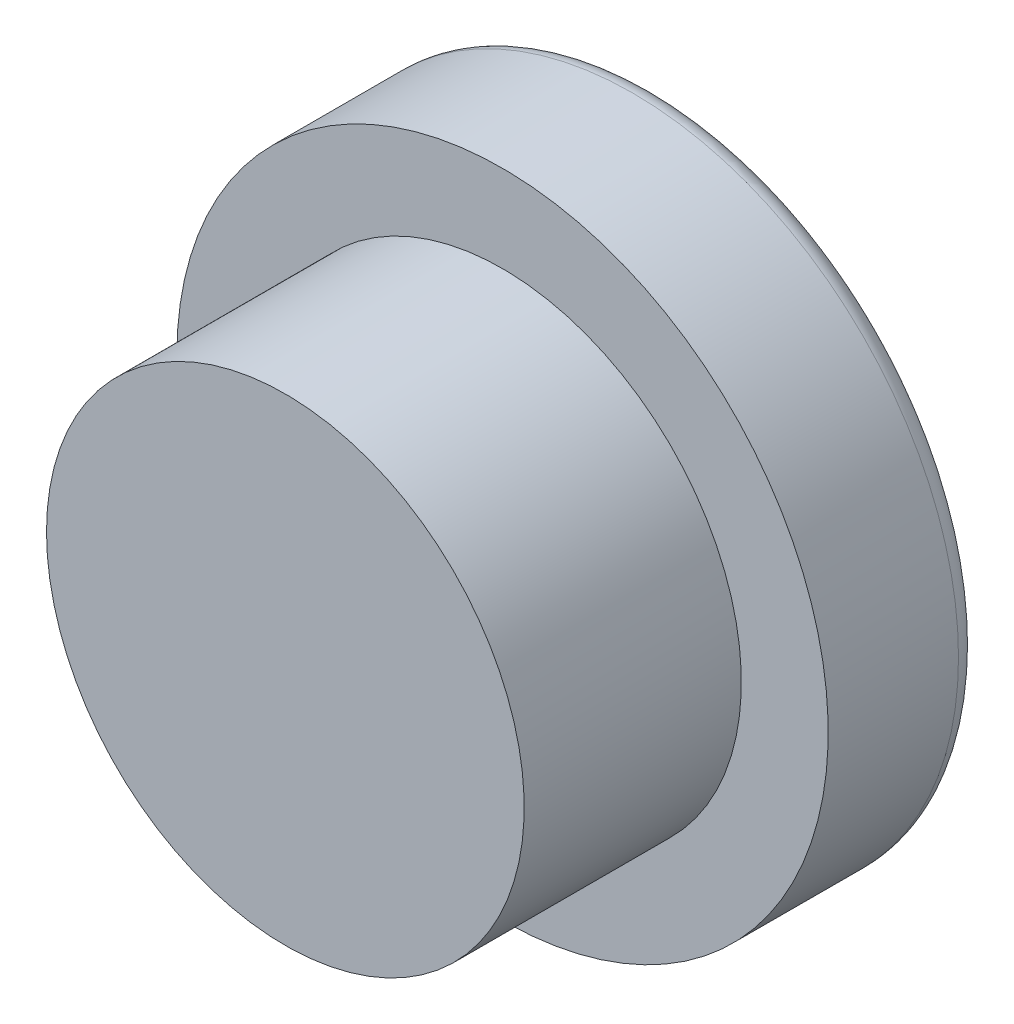
ISO-10303-21;
HEADER;
FILE_DESCRIPTION(('STEP AP214'),'2;1');
FILE_NAME('part.step','',(''),(''),'','','');
FILE_SCHEMA(('AUTOMOTIVE_DESIGN { 1 0 10303 214 1 1 1 1 }'));
ENDSEC;
DATA;
#1=APPLICATION_CONTEXT('core data for automotive mechanical design processes');
#2=APPLICATION_PROTOCOL_DEFINITION('international standard','automotive_design',2000,#1);
#3=PRODUCT_CONTEXT('',#1,'mechanical');
#4=PRODUCT('Part','Part','',(#3));
#5=PRODUCT_RELATED_PRODUCT_CATEGORY('part','',(#4));
#6=PRODUCT_DEFINITION_FORMATION('','',#4);
#7=PRODUCT_DEFINITION_CONTEXT('part definition',#1,'design');
#8=PRODUCT_DEFINITION('design','',#6,#7);
#9=PRODUCT_DEFINITION_SHAPE('','',#8);
#10=(LENGTH_UNIT() NAMED_UNIT(*) SI_UNIT(.MILLI.,.METRE.));
#11=(NAMED_UNIT(*) PLANE_ANGLE_UNIT() SI_UNIT($,.RADIAN.));
#12=(NAMED_UNIT(*) SI_UNIT($,.STERADIAN.) SOLID_ANGLE_UNIT());
#13=UNCERTAINTY_MEASURE_WITH_UNIT(LENGTH_MEASURE(1.E-05),#10,'distance_accuracy_value','');
#14=(GEOMETRIC_REPRESENTATION_CONTEXT(3) GLOBAL_UNCERTAINTY_ASSIGNED_CONTEXT((#13)) GLOBAL_UNIT_ASSIGNED_CONTEXT((#10,
#11,#12)) REPRESENTATION_CONTEXT('',''));
#15=CARTESIAN_POINT('',(0.,0.,0.));
#16=DIRECTION('',(0.,0.,1.));
#17=DIRECTION('',(1.,0.,0.));
#18=AXIS2_PLACEMENT_3D('',#15,#16,#17);
#19=CARTESIAN_POINT('',(0.,0.,17.));
#20=DIRECTION('',(0.,0.,1.));
#21=DIRECTION('',(1.,0.,0.));
#22=AXIS2_PLACEMENT_3D('',#19,#20,#21);
#23=PLANE('',#22);
#24=CARTESIAN_POINT('',(0.,0.,17.));
#25=DIRECTION('',(0.,0.,-1.));
#26=DIRECTION('',(-1.,0.,0.));
#27=AXIS2_PLACEMENT_3D('',#24,#25,#26);
#28=CIRCLE('',#27,11.);
#29=CARTESIAN_POINT('',(-11.,0.,17.));
#30=VERTEX_POINT('',#29);
#31=EDGE_CURVE('E19',#30,#30,#28,.T.);
#32=ORIENTED_EDGE('',*,*,#31,.F.);
#33=EDGE_LOOP('',(#32));
#34=FACE_BOUND('',#33,.T.);
#35=ADVANCED_FACE('F15',(#34),#23,.T.);
#36=CARTESIAN_POINT('',(0.,0.,17.));
#37=DIRECTION('',(0.,0.,-1.));
#38=DIRECTION('',(-1.,0.,0.));
#39=AXIS2_PLACEMENT_3D('',#36,#37,#38);
#40=CYLINDRICAL_SURFACE('',#39,11.);
#41=ORIENTED_EDGE('',*,*,#31,.T.);
#42=EDGE_LOOP('',(#41));
#43=FACE_BOUND('',#42,.T.);
#44=CARTESIAN_POINT('',(0.,0.,7.));
#45=DIRECTION('',(0.,0.,-1.));
#46=DIRECTION('',(-1.,0.,0.));
#47=AXIS2_PLACEMENT_3D('',#44,#45,#46);
#48=CIRCLE('',#47,11.);
#49=CARTESIAN_POINT('',(-11.,0.,7.));
#50=VERTEX_POINT('',#49);
#51=EDGE_CURVE('E32',#50,#50,#48,.T.);
#52=ORIENTED_EDGE('',*,*,#51,.F.);
#53=EDGE_LOOP('',(#52));
#54=FACE_BOUND('',#53,.T.);
#55=ADVANCED_FACE('F39',(#43,#54),#40,.T.);
#56=CARTESIAN_POINT('',(0.,0.,7.));
#57=DIRECTION('',(0.,0.,1.));
#58=DIRECTION('',(1.,0.,0.));
#59=AXIS2_PLACEMENT_3D('',#56,#57,#58);
#60=PLANE('',#59);
#61=CARTESIAN_POINT('',(0.,0.,7.));
#62=DIRECTION('',(0.,0.,-1.));
#63=DIRECTION('',(-1.,0.,0.));
#64=AXIS2_PLACEMENT_3D('',#61,#62,#63);
#65=CIRCLE('',#64,15.);
#66=CARTESIAN_POINT('',(-15.,0.,7.));
#67=VERTEX_POINT('',#66);
#68=EDGE_CURVE('E28',#67,#67,#65,.T.);
#69=ORIENTED_EDGE('',*,*,#68,.F.);
#70=EDGE_LOOP('',(#69));
#71=FACE_BOUND('',#70,.T.);
#72=ORIENTED_EDGE('',*,*,#51,.T.);
#73=EDGE_LOOP('',(#72));
#74=FACE_BOUND('',#73,.T.);
#75=ADVANCED_FACE('F47',(#71,#74),#60,.T.);
#76=CARTESIAN_POINT('',(0.,0.,7.));
#77=DIRECTION('',(0.,0.,-1.));
#78=DIRECTION('',(-1.,0.,0.));
#79=AXIS2_PLACEMENT_3D('',#76,#77,#78);
#80=CYLINDRICAL_SURFACE('',#79,15.);
#81=ORIENTED_EDGE('',*,*,#68,.T.);
#82=EDGE_LOOP('',(#81));
#83=FACE_BOUND('',#82,.T.);
#84=CARTESIAN_POINT('',(0.,0.,1.));
#85=DIRECTION('',(0.,0.,-1.));
#86=DIRECTION('',(-1.,0.,0.));
#87=AXIS2_PLACEMENT_3D('',#84,#85,#86);
#88=CIRCLE('',#87,15.);
#89=CARTESIAN_POINT('',(-15.,0.,1.));
#90=VERTEX_POINT('',#89);
#91=EDGE_CURVE('E23',#90,#90,#88,.T.);
#92=ORIENTED_EDGE('',*,*,#91,.F.);
#93=EDGE_LOOP('',(#92));
#94=FACE_BOUND('',#93,.T.);
#95=ADVANCED_FACE('F56',(#83,#94),#80,.T.);
#96=CARTESIAN_POINT('',(0.,0.,1.));
#97=DIRECTION('',(0.,0.,1.));
#98=DIRECTION('',(1.,0.,0.));
#99=AXIS2_PLACEMENT_3D('',#96,#97,#98);
#100=TOROIDAL_SURFACE('',#99,14.,1.);
#101=CARTESIAN_POINT('',(0.,0.,0.));
#102=DIRECTION('',(0.,0.,1.));
#103=DIRECTION('',(1.,0.,0.));
#104=AXIS2_PLACEMENT_3D('',#101,#102,#103);
#105=CIRCLE('',#104,14.);
#106=CARTESIAN_POINT('',(14.,0.,0.));
#107=VERTEX_POINT('',#106);
#108=EDGE_CURVE('E10',#107,#107,#105,.T.);
#109=ORIENTED_EDGE('',*,*,#108,.T.);
#110=EDGE_LOOP('',(#109));
#111=FACE_BOUND('',#110,.T.);
#112=ORIENTED_EDGE('',*,*,#91,.T.);
#113=EDGE_LOOP('',(#112));
#114=FACE_BOUND('',#113,.T.);
#115=ADVANCED_FACE('F17',(#111,#114),#100,.T.);
#116=CARTESIAN_POINT('',(0.,0.,0.));
#117=DIRECTION('',(0.,0.,1.));
#118=DIRECTION('',(1.,0.,0.));
#119=AXIS2_PLACEMENT_3D('',#116,#117,#118);
#120=PLANE('',#119);
#121=ORIENTED_EDGE('',*,*,#108,.F.);
#122=EDGE_LOOP('',(#121));
#123=FACE_BOUND('',#122,.T.);
#124=ADVANCED_FACE('F49',(#123),#120,.F.);
#125=CLOSED_SHELL('',(#35,#55,#75,#95,#115,#124));
#126=MANIFOLD_SOLID_BREP('B1',#125);
#127=ADVANCED_BREP_SHAPE_REPRESENTATION('',(#18,#126),#14);
#128=SHAPE_DEFINITION_REPRESENTATION(#9,#127);
ENDSEC;
END-ISO-10303-21;
